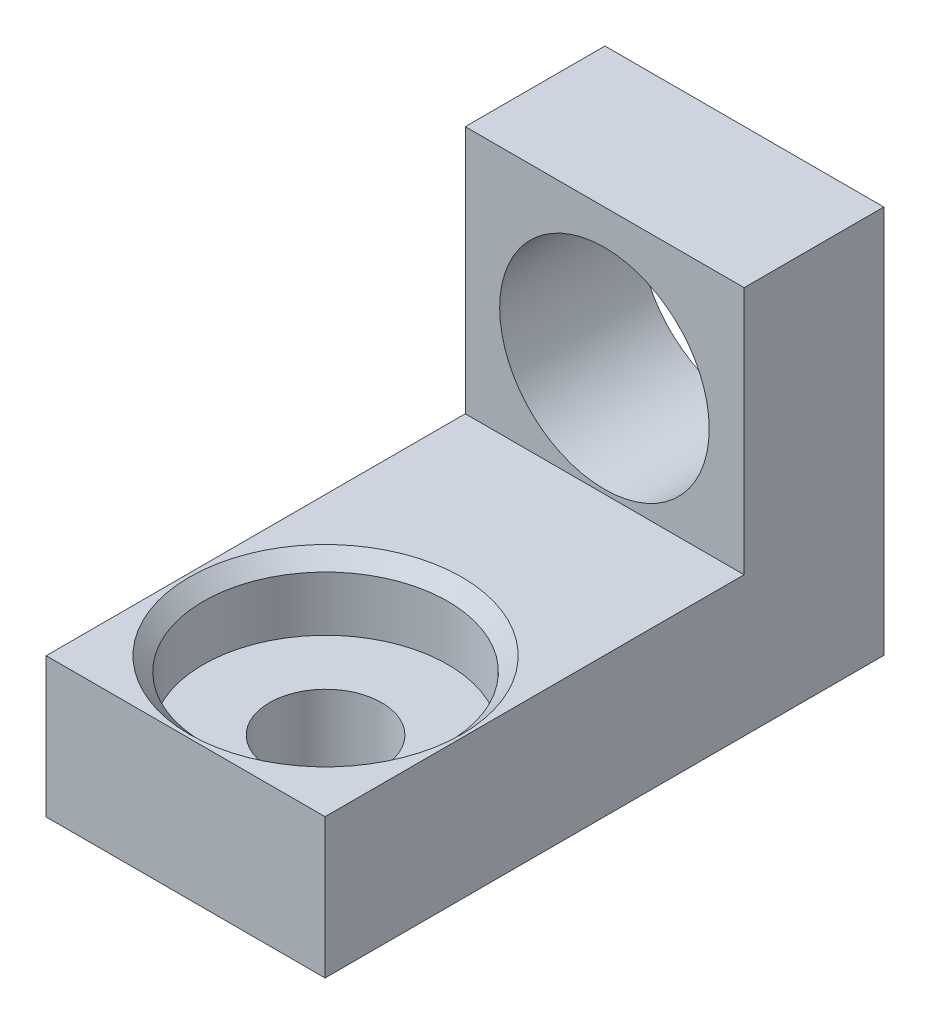
ISO-10303-21;
HEADER;
FILE_DESCRIPTION(('STEP AP214'),'2;1');
FILE_NAME('part.step','',(''),(''),'','','');
FILE_SCHEMA(('AUTOMOTIVE_DESIGN { 1 0 10303 214 1 1 1 1 }'));
ENDSEC;
DATA;
#1=APPLICATION_CONTEXT('core data for automotive mechanical design processes');
#2=APPLICATION_PROTOCOL_DEFINITION('international standard','automotive_design',2000,#1);
#3=PRODUCT_CONTEXT('',#1,'mechanical');
#4=PRODUCT('Part','Part','',(#3));
#5=PRODUCT_RELATED_PRODUCT_CATEGORY('part','',(#4));
#6=PRODUCT_DEFINITION_FORMATION('','',#4);
#7=PRODUCT_DEFINITION_CONTEXT('part definition',#1,'design');
#8=PRODUCT_DEFINITION('design','',#6,#7);
#9=PRODUCT_DEFINITION_SHAPE('','',#8);
#10=(LENGTH_UNIT() NAMED_UNIT(*) SI_UNIT(.MILLI.,.METRE.));
#11=(NAMED_UNIT(*) PLANE_ANGLE_UNIT() SI_UNIT($,.RADIAN.));
#12=(NAMED_UNIT(*) SI_UNIT($,.STERADIAN.) SOLID_ANGLE_UNIT());
#13=UNCERTAINTY_MEASURE_WITH_UNIT(LENGTH_MEASURE(1.E-05),#10,'distance_accuracy_value','');
#14=(GEOMETRIC_REPRESENTATION_CONTEXT(3) GLOBAL_UNCERTAINTY_ASSIGNED_CONTEXT((#13)) GLOBAL_UNIT_ASSIGNED_CONTEXT((#10,
#11,#12)) REPRESENTATION_CONTEXT('',''));
#15=CARTESIAN_POINT('',(0.,0.,0.));
#16=DIRECTION('',(0.,0.,1.));
#17=DIRECTION('',(1.,0.,0.));
#18=AXIS2_PLACEMENT_3D('',#15,#16,#17);
#19=CARTESIAN_POINT('',(0.,0.,6.35));
#20=DIRECTION('',(0.,0.,-1.));
#21=DIRECTION('',(-1.,0.,0.));
#22=AXIS2_PLACEMENT_3D('',#19,#20,#21);
#23=PLANE('',#22);
#24=CARTESIAN_POINT('',(0.,0.,6.35));
#25=DIRECTION('',(0.,0.,1.));
#26=DIRECTION('',(1.,0.,0.));
#27=AXIS2_PLACEMENT_3D('',#24,#25,#26);
#28=CIRCLE('',#27,4.7625);
#29=CARTESIAN_POINT('',(4.7625,0.,6.35));
#30=VERTEX_POINT('',#29);
#31=EDGE_CURVE('E91',#30,#30,#28,.T.);
#32=ORIENTED_EDGE('',*,*,#31,.F.);
#33=EDGE_LOOP('',(#32));
#34=FACE_BOUND('',#33,.T.);
#35=DIRECTION('',(-1.,0.,0.));
#36=VECTOR('',#35,1.);
#37=CARTESIAN_POINT('',(-6.32686783314895,-4.953,6.35));
#38=LINE('',#37,#36);
#39=CARTESIAN_POINT('',(6.35,-4.953,6.35));
#40=VERTEX_POINT('',#39);
#41=CARTESIAN_POINT('',(-6.32686783314895,-4.953,6.35));
#42=VERTEX_POINT('',#41);
#43=EDGE_CURVE('E55',#40,#42,#38,.T.);
#44=ORIENTED_EDGE('',*,*,#43,.F.);
#45=DIRECTION('',(0.,1.,0.));
#46=VECTOR('',#45,1.);
#47=CARTESIAN_POINT('',(6.35,-11.303,6.35));
#48=LINE('',#47,#46);
#49=CARTESIAN_POINT('',(6.35,6.35,6.35));
#50=VERTEX_POINT('',#49);
#51=EDGE_CURVE('E110',#40,#50,#48,.T.);
#52=ORIENTED_EDGE('',*,*,#51,.T.);
#53=DIRECTION('',(-1.,0.,0.));
#54=VECTOR('',#53,1.);
#55=CARTESIAN_POINT('',(-6.32686783314895,6.35,6.35));
#56=LINE('',#55,#54);
#57=CARTESIAN_POINT('',(-6.32686783314895,6.35,6.35));
#58=VERTEX_POINT('',#57);
#59=EDGE_CURVE('E61',#50,#58,#56,.T.);
#60=ORIENTED_EDGE('',*,*,#59,.T.);
#61=DIRECTION('',(0.,-1.,0.));
#62=VECTOR('',#61,1.);
#63=CARTESIAN_POINT('',(-6.32686783314895,0.,6.35));
#64=LINE('',#63,#62);
#65=EDGE_CURVE('E101',#58,#42,#64,.T.);
#66=ORIENTED_EDGE('',*,*,#65,.T.);
#67=EDGE_LOOP('',(#44,#52,#60,#66));
#68=FACE_BOUND('',#67,.T.);
#69=ADVANCED_FACE('F39',(#34,#68),#23,.F.);
#70=CARTESIAN_POINT('',(0.,0.,0.));
#71=DIRECTION('',(0.,0.,-1.));
#72=DIRECTION('',(-1.,0.,0.));
#73=AXIS2_PLACEMENT_3D('',#70,#71,#72);
#74=PLANE('',#73);
#75=DIRECTION('',(0.,-1.,0.));
#76=VECTOR('',#75,1.);
#77=CARTESIAN_POINT('',(-6.32686783314895,0.,0.));
#78=LINE('',#77,#76);
#79=CARTESIAN_POINT('',(-6.32686783314895,6.35,0.));
#80=VERTEX_POINT('',#79);
#81=CARTESIAN_POINT('',(-6.32686783314895,-11.303,0.));
#82=VERTEX_POINT('',#81);
#83=EDGE_CURVE('E80',#80,#82,#78,.T.);
#84=ORIENTED_EDGE('',*,*,#83,.F.);
#85=DIRECTION('',(-1.,0.,0.));
#86=VECTOR('',#85,1.);
#87=CARTESIAN_POINT('',(-6.32686783314895,6.35,0.));
#88=LINE('',#87,#86);
#89=CARTESIAN_POINT('',(6.35,6.35,0.));
#90=VERTEX_POINT('',#89);
#91=EDGE_CURVE('E84',#90,#80,#88,.T.);
#92=ORIENTED_EDGE('',*,*,#91,.F.);
#93=DIRECTION('',(0.,1.,0.));
#94=VECTOR('',#93,1.);
#95=CARTESIAN_POINT('',(6.35,6.35,0.));
#96=LINE('',#95,#94);
#97=CARTESIAN_POINT('',(6.35,-11.303,0.));
#98=VERTEX_POINT('',#97);
#99=EDGE_CURVE('E102',#98,#90,#96,.T.);
#100=ORIENTED_EDGE('',*,*,#99,.F.);
#101=DIRECTION('',(1.,0.,0.));
#102=VECTOR('',#101,1.);
#103=CARTESIAN_POINT('',(-6.32686783314895,-11.303,0.));
#104=LINE('',#103,#102);
#105=EDGE_CURVE('E86',#82,#98,#104,.T.);
#106=ORIENTED_EDGE('',*,*,#105,.F.);
#107=EDGE_LOOP('',(#84,#92,#100,#106));
#108=FACE_BOUND('',#107,.T.);
#109=CARTESIAN_POINT('',(0.,0.,0.));
#110=DIRECTION('',(0.,0.,1.));
#111=DIRECTION('',(1.,0.,0.));
#112=AXIS2_PLACEMENT_3D('',#109,#110,#111);
#113=CIRCLE('',#112,4.7625);
#114=CARTESIAN_POINT('',(4.7625,0.,0.));
#115=VERTEX_POINT('',#114);
#116=EDGE_CURVE('E158',#115,#115,#113,.T.);
#117=ORIENTED_EDGE('',*,*,#116,.T.);
#118=EDGE_LOOP('',(#117));
#119=FACE_BOUND('',#118,.T.);
#120=ADVANCED_FACE('F82',(#108,#119),#74,.T.);
#121=CARTESIAN_POINT('',(-6.32686783314895,0.,6.35));
#122=DIRECTION('',(1.,0.,0.));
#123=DIRECTION('',(0.,1.,0.));
#124=AXIS2_PLACEMENT_3D('',#121,#122,#123);
#125=PLANE('',#124);
#126=ORIENTED_EDGE('',*,*,#83,.T.);
#127=DIRECTION('',(0.,0.,-1.));
#128=VECTOR('',#127,1.);
#129=CARTESIAN_POINT('',(-6.32686783314895,-11.303,6.35));
#130=LINE('',#129,#128);
#131=CARTESIAN_POINT('',(-6.32686783314895,-11.303,25.4));
#132=VERTEX_POINT('',#131);
#133=EDGE_CURVE('E11',#132,#82,#130,.T.);
#134=ORIENTED_EDGE('',*,*,#133,.F.);
#135=DIRECTION('',(0.,-1.,0.));
#136=VECTOR('',#135,1.);
#137=CARTESIAN_POINT('',(-6.32686783314895,-11.303,25.4));
#138=LINE('',#137,#136);
#139=CARTESIAN_POINT('',(-6.32686783314895,-4.953,25.4));
#140=VERTEX_POINT('',#139);
#141=EDGE_CURVE('E136',#140,#132,#138,.T.);
#142=ORIENTED_EDGE('',*,*,#141,.F.);
#143=DIRECTION('',(0.,0.,-1.));
#144=VECTOR('',#143,1.);
#145=CARTESIAN_POINT('',(-6.32686783314895,-4.953,25.4));
#146=LINE('',#145,#144);
#147=EDGE_CURVE('E148',#140,#42,#146,.T.);
#148=ORIENTED_EDGE('',*,*,#147,.T.);
#149=ORIENTED_EDGE('',*,*,#65,.F.);
#150=DIRECTION('',(0.,0.,-1.));
#151=VECTOR('',#150,1.);
#152=CARTESIAN_POINT('',(-6.32686783314895,6.35,6.35));
#153=LINE('',#152,#151);
#154=EDGE_CURVE('E96',#58,#80,#153,.T.);
#155=ORIENTED_EDGE('',*,*,#154,.T.);
#156=EDGE_LOOP('',(#126,#134,#142,#148,#149,#155));
#157=FACE_BOUND('',#156,.T.);
#158=ADVANCED_FACE('F41',(#157),#125,.F.);
#159=CARTESIAN_POINT('',(-6.32686783314895,-11.303,6.35));
#160=DIRECTION('',(0.,1.,0.));
#161=DIRECTION('',(0.,0.,1.));
#162=AXIS2_PLACEMENT_3D('',#159,#160,#161);
#163=PLANE('',#162);
#164=CARTESIAN_POINT('',(0.0231321668510498,-11.303,19.05));
#165=DIRECTION('',(0.,1.,0.));
#166=DIRECTION('',(0.,0.,1.));
#167=AXIS2_PLACEMENT_3D('',#164,#165,#166);
#168=CIRCLE('',#167,2.5527);
#169=CARTESIAN_POINT('',(0.0231321668510498,-11.303,21.6027));
#170=VERTEX_POINT('',#169);
#171=EDGE_CURVE('E151',#170,#170,#168,.T.);
#172=ORIENTED_EDGE('',*,*,#171,.T.);
#173=EDGE_LOOP('',(#172));
#174=FACE_BOUND('',#173,.T.);
#175=ORIENTED_EDGE('',*,*,#105,.T.);
#176=DIRECTION('',(0.,0.,-1.));
#177=VECTOR('',#176,1.);
#178=CARTESIAN_POINT('',(6.35,-11.303,6.35));
#179=LINE('',#178,#177);
#180=CARTESIAN_POINT('',(6.35,-11.303,25.4));
#181=VERTEX_POINT('',#180);
#182=EDGE_CURVE('E48',#181,#98,#179,.T.);
#183=ORIENTED_EDGE('',*,*,#182,.F.);
#184=DIRECTION('',(1.,0.,0.));
#185=VECTOR('',#184,1.);
#186=CARTESIAN_POINT('',(-6.32686783314895,-11.303,25.4));
#187=LINE('',#186,#185);
#188=EDGE_CURVE('E128',#132,#181,#187,.T.);
#189=ORIENTED_EDGE('',*,*,#188,.F.);
#190=ORIENTED_EDGE('',*,*,#133,.T.);
#191=EDGE_LOOP('',(#175,#183,#189,#190));
#192=FACE_BOUND('',#191,.T.);
#193=ADVANCED_FACE('F126',(#174,#192),#163,.F.);
#194=CARTESIAN_POINT('',(6.35,6.35,6.35));
#195=DIRECTION('',(-1.,0.,0.));
#196=DIRECTION('',(0.,-1.,0.));
#197=AXIS2_PLACEMENT_3D('',#194,#195,#196);
#198=PLANE('',#197);
#199=ORIENTED_EDGE('',*,*,#99,.T.);
#200=DIRECTION('',(0.,0.,-1.));
#201=VECTOR('',#200,1.);
#202=CARTESIAN_POINT('',(6.35,6.35,6.35));
#203=LINE('',#202,#201);
#204=EDGE_CURVE('E99',#50,#90,#203,.T.);
#205=ORIENTED_EDGE('',*,*,#204,.F.);
#206=ORIENTED_EDGE('',*,*,#51,.F.);
#207=DIRECTION('',(0.,0.,-1.));
#208=VECTOR('',#207,1.);
#209=CARTESIAN_POINT('',(6.35,-4.953,25.4));
#210=LINE('',#209,#208);
#211=CARTESIAN_POINT('',(6.35,-4.953,25.4));
#212=VERTEX_POINT('',#211);
#213=EDGE_CURVE('E154',#212,#40,#210,.T.);
#214=ORIENTED_EDGE('',*,*,#213,.F.);
#215=DIRECTION('',(0.,1.,0.));
#216=VECTOR('',#215,1.);
#217=CARTESIAN_POINT('',(6.35,-11.303,25.4));
#218=LINE('',#217,#216);
#219=EDGE_CURVE('E122',#181,#212,#218,.T.);
#220=ORIENTED_EDGE('',*,*,#219,.F.);
#221=ORIENTED_EDGE('',*,*,#182,.T.);
#222=EDGE_LOOP('',(#199,#205,#206,#214,#220,#221));
#223=FACE_BOUND('',#222,.T.);
#224=ADVANCED_FACE('F118',(#223),#198,.F.);
#225=CARTESIAN_POINT('',(-6.32686783314895,6.35,6.35));
#226=DIRECTION('',(0.,-1.,0.));
#227=DIRECTION('',(0.,0.,-1.));
#228=AXIS2_PLACEMENT_3D('',#225,#226,#227);
#229=PLANE('',#228);
#230=ORIENTED_EDGE('',*,*,#91,.T.);
#231=ORIENTED_EDGE('',*,*,#154,.F.);
#232=ORIENTED_EDGE('',*,*,#59,.F.);
#233=ORIENTED_EDGE('',*,*,#204,.T.);
#234=EDGE_LOOP('',(#230,#231,#232,#233));
#235=FACE_BOUND('',#234,.T.);
#236=ADVANCED_FACE('F95',(#235),#229,.F.);
#237=CARTESIAN_POINT('',(0.,0.,6.35));
#238=DIRECTION('',(0.,0.,-1.));
#239=DIRECTION('',(-1.,0.,0.));
#240=AXIS2_PLACEMENT_3D('',#237,#238,#239);
#241=CYLINDRICAL_SURFACE('',#240,4.7625);
#242=ORIENTED_EDGE('',*,*,#31,.T.);
#243=EDGE_LOOP('',(#242));
#244=FACE_BOUND('',#243,.T.);
#245=ORIENTED_EDGE('',*,*,#116,.F.);
#246=EDGE_LOOP('',(#245));
#247=FACE_BOUND('',#246,.T.);
#248=ADVANCED_FACE('F180',(#244,#247),#241,.F.);
#249=CARTESIAN_POINT('',(-6.32686783314895,-4.953,25.4));
#250=DIRECTION('',(0.,-1.,0.));
#251=DIRECTION('',(0.,0.,-1.));
#252=AXIS2_PLACEMENT_3D('',#249,#250,#251);
#253=PLANE('',#252);
#254=CARTESIAN_POINT('',(0.0231321668510498,-4.953,19.05));
#255=DIRECTION('',(0.,1.,0.));
#256=DIRECTION('',(0.,0.,1.));
#257=AXIS2_PLACEMENT_3D('',#254,#255,#256);
#258=CIRCLE('',#257,6.19125);
#259=CARTESIAN_POINT('',(0.0231321668510498,-4.953,25.24125));
#260=VERTEX_POINT('',#259);
#261=EDGE_CURVE('E226',#260,#260,#258,.T.);
#262=ORIENTED_EDGE('',*,*,#261,.F.);
#263=EDGE_LOOP('',(#262));
#264=FACE_BOUND('',#263,.T.);
#265=ORIENTED_EDGE('',*,*,#43,.T.);
#266=ORIENTED_EDGE('',*,*,#147,.F.);
#267=DIRECTION('',(-1.,0.,0.));
#268=VECTOR('',#267,1.);
#269=CARTESIAN_POINT('',(-6.32686783314895,-4.953,25.4));
#270=LINE('',#269,#268);
#271=EDGE_CURVE('E141',#212,#140,#270,.T.);
#272=ORIENTED_EDGE('',*,*,#271,.F.);
#273=ORIENTED_EDGE('',*,*,#213,.T.);
#274=EDGE_LOOP('',(#265,#266,#272,#273));
#275=FACE_BOUND('',#274,.T.);
#276=ADVANCED_FACE('F173',(#264,#275),#253,.F.);
#277=CARTESIAN_POINT('',(0.,0.,25.4));
#278=DIRECTION('',(0.,0.,-1.));
#279=DIRECTION('',(-1.,0.,0.));
#280=AXIS2_PLACEMENT_3D('',#277,#278,#279);
#281=PLANE('',#280);
#282=ORIENTED_EDGE('',*,*,#141,.T.);
#283=ORIENTED_EDGE('',*,*,#188,.T.);
#284=ORIENTED_EDGE('',*,*,#219,.T.);
#285=ORIENTED_EDGE('',*,*,#271,.T.);
#286=EDGE_LOOP('',(#282,#283,#284,#285));
#287=FACE_BOUND('',#286,.T.);
#288=ADVANCED_FACE('F133',(#287),#281,.F.);
#289=CARTESIAN_POINT('',(0.0231321668510498,-4.953,19.05));
#290=DIRECTION('',(0.,1.,0.));
#291=DIRECTION('',(0.,0.,1.));
#292=AXIS2_PLACEMENT_3D('',#289,#290,#291);
#293=CYLINDRICAL_SURFACE('',#292,2.5527);
#294=ORIENTED_EDGE('',*,*,#171,.F.);
#295=EDGE_LOOP('',(#294));
#296=FACE_BOUND('',#295,.T.);
#297=CARTESIAN_POINT('',(0.0231321668510498,-8.0772,19.05));
#298=DIRECTION('',(0.,1.,0.));
#299=DIRECTION('',(0.,0.,1.));
#300=AXIS2_PLACEMENT_3D('',#297,#298,#299);
#301=CIRCLE('',#300,2.5527);
#302=CARTESIAN_POINT('',(0.0231321668510498,-8.0772,21.6027));
#303=VERTEX_POINT('',#302);
#304=EDGE_CURVE('E213',#303,#303,#301,.T.);
#305=ORIENTED_EDGE('',*,*,#304,.T.);
#306=EDGE_LOOP('',(#305));
#307=FACE_BOUND('',#306,.T.);
#308=ADVANCED_FACE('F187',(#296,#307),#293,.F.);
#309=CARTESIAN_POINT('',(5.57938216685105,-8.0772,19.05));
#310=DIRECTION('',(0.,-1.,0.));
#311=DIRECTION('',(0.,0.,-1.));
#312=AXIS2_PLACEMENT_3D('',#309,#310,#311);
#313=PLANE('',#312);
#314=ORIENTED_EDGE('',*,*,#304,.F.);
#315=EDGE_LOOP('',(#314));
#316=FACE_BOUND('',#315,.T.);
#317=CARTESIAN_POINT('',(0.0231321668510498,-8.0772,19.05));
#318=DIRECTION('',(0.,1.,0.));
#319=DIRECTION('',(0.,0.,1.));
#320=AXIS2_PLACEMENT_3D('',#317,#318,#319);
#321=CIRCLE('',#320,5.55625);
#322=CARTESIAN_POINT('',(0.0231321668510498,-8.0772,24.60625));
#323=VERTEX_POINT('',#322);
#324=EDGE_CURVE('E216',#323,#323,#321,.T.);
#325=ORIENTED_EDGE('',*,*,#324,.T.);
#326=EDGE_LOOP('',(#325));
#327=FACE_BOUND('',#326,.T.);
#328=ADVANCED_FACE('F238',(#316,#327),#313,.F.);
#329=CARTESIAN_POINT('',(0.0231321668510498,-4.953,19.05));
#330=DIRECTION('',(0.,1.,0.));
#331=DIRECTION('',(0.,0.,1.));
#332=AXIS2_PLACEMENT_3D('',#329,#330,#331);
#333=CYLINDRICAL_SURFACE('',#332,5.55625);
#334=ORIENTED_EDGE('',*,*,#324,.F.);
#335=EDGE_LOOP('',(#334));
#336=FACE_BOUND('',#335,.T.);
#337=CARTESIAN_POINT('',(0.0231321668510498,-5.588,19.05));
#338=DIRECTION('',(0.,1.,0.));
#339=DIRECTION('',(0.,0.,1.));
#340=AXIS2_PLACEMENT_3D('',#337,#338,#339);
#341=CIRCLE('',#340,5.55625);
#342=CARTESIAN_POINT('',(0.0231321668510498,-5.588,24.60625));
#343=VERTEX_POINT('',#342);
#344=EDGE_CURVE('E222',#343,#343,#341,.T.);
#345=ORIENTED_EDGE('',*,*,#344,.T.);
#346=EDGE_LOOP('',(#345));
#347=FACE_BOUND('',#346,.T.);
#348=ADVANCED_FACE('F232',(#336,#347),#333,.F.);
#349=CARTESIAN_POINT('',(0.0231321668510498,-4.953,19.05));
#350=DIRECTION('',(0.,1.,0.));
#351=DIRECTION('',(0.,0.,1.));
#352=AXIS2_PLACEMENT_3D('',#349,#350,#351);
#353=CONICAL_SURFACE('',#352,6.19125,0.785398163397448);
#354=ORIENTED_EDGE('',*,*,#344,.F.);
#355=EDGE_LOOP('',(#354));
#356=FACE_BOUND('',#355,.T.);
#357=ORIENTED_EDGE('',*,*,#261,.T.);
#358=EDGE_LOOP('',(#357));
#359=FACE_BOUND('',#358,.T.);
#360=ADVANCED_FACE('F230',(#356,#359),#353,.F.);
#361=CLOSED_SHELL('',(#69,#120,#158,#193,#224,#236,#248,#276,#288,#308,#328,#348,#360));
#362=MANIFOLD_SOLID_BREP('B2',#361);
#363=ADVANCED_BREP_SHAPE_REPRESENTATION('',(#18,#362),#14);
#364=SHAPE_DEFINITION_REPRESENTATION(#9,#363);
ENDSEC;
END-ISO-10303-21;
